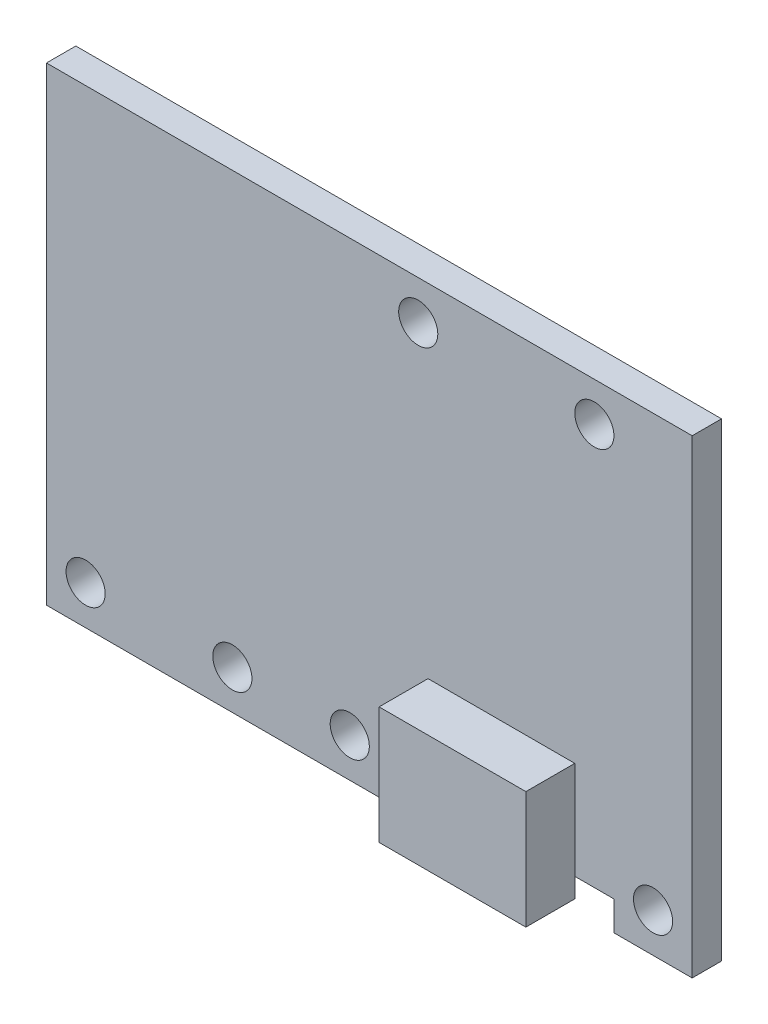
ISO-10303-21;
HEADER;
FILE_DESCRIPTION(('STEP AP214'),'2;1');
FILE_NAME('part.step','',(''),(''),'','','');
FILE_SCHEMA(('AUTOMOTIVE_DESIGN { 1 0 10303 214 1 1 1 1 }'));
ENDSEC;
DATA;
#1=APPLICATION_CONTEXT('core data for automotive mechanical design processes');
#2=APPLICATION_PROTOCOL_DEFINITION('international standard','automotive_design',2000,#1);
#3=PRODUCT_CONTEXT('',#1,'mechanical');
#4=PRODUCT('Part','Part','',(#3));
#5=PRODUCT_RELATED_PRODUCT_CATEGORY('part','',(#4));
#6=PRODUCT_DEFINITION_FORMATION('','',#4);
#7=PRODUCT_DEFINITION_CONTEXT('part definition',#1,'design');
#8=PRODUCT_DEFINITION('design','',#6,#7);
#9=PRODUCT_DEFINITION_SHAPE('','',#8);
#10=(LENGTH_UNIT() NAMED_UNIT(*) SI_UNIT(.MILLI.,.METRE.));
#11=(NAMED_UNIT(*) PLANE_ANGLE_UNIT() SI_UNIT($,.RADIAN.));
#12=(NAMED_UNIT(*) SI_UNIT($,.STERADIAN.) SOLID_ANGLE_UNIT());
#13=UNCERTAINTY_MEASURE_WITH_UNIT(LENGTH_MEASURE(1.E-05),#10,'distance_accuracy_value','');
#14=(GEOMETRIC_REPRESENTATION_CONTEXT(3) GLOBAL_UNCERTAINTY_ASSIGNED_CONTEXT((#13)) GLOBAL_UNIT_ASSIGNED_CONTEXT((#10,
#11,#12)) REPRESENTATION_CONTEXT('',''));
#15=CARTESIAN_POINT('',(0.,0.,0.));
#16=DIRECTION('',(0.,0.,1.));
#17=DIRECTION('',(1.,0.,0.));
#18=AXIS2_PLACEMENT_3D('',#15,#16,#17);
#19=CARTESIAN_POINT('',(0.,-12.,-1.5));
#20=DIRECTION('',(0.,-1.,0.));
#21=DIRECTION('',(0.,0.,-1.));
#22=AXIS2_PLACEMENT_3D('',#19,#20,#21);
#23=PLANE('',#22);
#24=DIRECTION('',(1.,0.,0.));
#25=VECTOR('',#24,1.);
#26=CARTESIAN_POINT('',(0.,-12.,0.));
#27=LINE('',#26,#25);
#28=CARTESIAN_POINT('',(-16.5,-12.,0.));
#29=VERTEX_POINT('',#28);
#30=CARTESIAN_POINT('',(1.,-12.,0.));
#31=VERTEX_POINT('',#30);
#32=EDGE_CURVE('E214',#29,#31,#27,.T.);
#33=ORIENTED_EDGE('',*,*,#32,.F.);
#34=DIRECTION('',(0.,0.,1.));
#35=VECTOR('',#34,1.);
#36=CARTESIAN_POINT('',(-16.5,-12.,-1.5));
#37=LINE('',#36,#35);
#38=CARTESIAN_POINT('',(-16.5,-12.,-1.5));
#39=VERTEX_POINT('',#38);
#40=EDGE_CURVE('E42',#39,#29,#37,.T.);
#41=ORIENTED_EDGE('',*,*,#40,.F.);
#42=DIRECTION('',(1.,0.,0.));
#43=VECTOR('',#42,1.);
#44=CARTESIAN_POINT('',(0.,-12.,-1.5));
#45=LINE('',#44,#43);
#46=CARTESIAN_POINT('',(1.,-12.,-1.5));
#47=VERTEX_POINT('',#46);
#48=EDGE_CURVE('E180',#39,#47,#45,.T.);
#49=ORIENTED_EDGE('',*,*,#48,.T.);
#50=DIRECTION('',(0.,0.,1.));
#51=VECTOR('',#50,1.);
#52=CARTESIAN_POINT('',(1.,-12.,-1.5));
#53=LINE('',#52,#51);
#54=EDGE_CURVE('E37',#47,#31,#53,.T.);
#55=ORIENTED_EDGE('',*,*,#54,.T.);
#56=EDGE_LOOP('',(#33,#41,#49,#55));
#57=FACE_BOUND('',#56,.T.);
#58=ADVANCED_FACE('F33',(#57),#23,.T.);
#59=CARTESIAN_POINT('',(-16.5,0.,-1.5));
#60=DIRECTION('',(-1.,0.,0.));
#61=DIRECTION('',(0.,-1.,0.));
#62=AXIS2_PLACEMENT_3D('',#59,#60,#61);
#63=PLANE('',#62);
#64=DIRECTION('',(0.,-1.,0.));
#65=VECTOR('',#64,1.);
#66=CARTESIAN_POINT('',(-16.5,0.,0.));
#67=LINE('',#66,#65);
#68=CARTESIAN_POINT('',(-16.5,12.,0.));
#69=VERTEX_POINT('',#68);
#70=EDGE_CURVE('E165',#69,#29,#67,.T.);
#71=ORIENTED_EDGE('',*,*,#70,.F.);
#72=DIRECTION('',(0.,0.,1.));
#73=VECTOR('',#72,1.);
#74=CARTESIAN_POINT('',(-16.5,12.,-1.5));
#75=LINE('',#74,#73);
#76=CARTESIAN_POINT('',(-16.5,12.,-1.5));
#77=VERTEX_POINT('',#76);
#78=EDGE_CURVE('E236',#77,#69,#75,.T.);
#79=ORIENTED_EDGE('',*,*,#78,.F.);
#80=DIRECTION('',(0.,-1.,0.));
#81=VECTOR('',#80,1.);
#82=CARTESIAN_POINT('',(-16.5,0.,-1.5));
#83=LINE('',#82,#81);
#84=EDGE_CURVE('E197',#77,#39,#83,.T.);
#85=ORIENTED_EDGE('',*,*,#84,.T.);
#86=ORIENTED_EDGE('',*,*,#40,.T.);
#87=EDGE_LOOP('',(#71,#79,#85,#86));
#88=FACE_BOUND('',#87,.T.);
#89=ADVANCED_FACE('F262',(#88),#63,.T.);
#90=CARTESIAN_POINT('',(0.,12.,-1.5));
#91=DIRECTION('',(0.,-1.,0.));
#92=DIRECTION('',(0.,0.,-1.));
#93=AXIS2_PLACEMENT_3D('',#90,#91,#92);
#94=PLANE('',#93);
#95=DIRECTION('',(1.,0.,0.));
#96=VECTOR('',#95,1.);
#97=CARTESIAN_POINT('',(0.,12.,0.));
#98=LINE('',#97,#96);
#99=CARTESIAN_POINT('',(16.5,12.,0.));
#100=VERTEX_POINT('',#99);
#101=EDGE_CURVE('E230',#69,#100,#98,.T.);
#102=ORIENTED_EDGE('',*,*,#101,.T.);
#103=DIRECTION('',(0.,0.,1.));
#104=VECTOR('',#103,1.);
#105=CARTESIAN_POINT('',(16.5,12.,-1.5));
#106=LINE('',#105,#104);
#107=CARTESIAN_POINT('',(16.5,12.,-1.5));
#108=VERTEX_POINT('',#107);
#109=EDGE_CURVE('E238',#108,#100,#106,.T.);
#110=ORIENTED_EDGE('',*,*,#109,.F.);
#111=DIRECTION('',(1.,0.,0.));
#112=VECTOR('',#111,1.);
#113=CARTESIAN_POINT('',(0.,12.,-1.5));
#114=LINE('',#113,#112);
#115=EDGE_CURVE('E194',#77,#108,#114,.T.);
#116=ORIENTED_EDGE('',*,*,#115,.F.);
#117=ORIENTED_EDGE('',*,*,#78,.T.);
#118=EDGE_LOOP('',(#102,#110,#116,#117));
#119=FACE_BOUND('',#118,.T.);
#120=ADVANCED_FACE('F309',(#119),#94,.F.);
#121=CARTESIAN_POINT('',(16.5,0.,-1.5));
#122=DIRECTION('',(-1.,0.,0.));
#123=DIRECTION('',(0.,0.,1.));
#124=AXIS2_PLACEMENT_3D('',#121,#122,#123);
#125=PLANE('',#124);
#126=DIRECTION('',(0.,-1.,0.));
#127=VECTOR('',#126,1.);
#128=CARTESIAN_POINT('',(16.5,0.,0.));
#129=LINE('',#128,#127);
#130=CARTESIAN_POINT('',(16.5,-12.,0.));
#131=VERTEX_POINT('',#130);
#132=EDGE_CURVE('E227',#100,#131,#129,.T.);
#133=ORIENTED_EDGE('',*,*,#132,.T.);
#134=DIRECTION('',(0.,0.,1.));
#135=VECTOR('',#134,1.);
#136=CARTESIAN_POINT('',(16.5,-12.,-1.5));
#137=LINE('',#136,#135);
#138=CARTESIAN_POINT('',(16.5,-12.,-1.5));
#139=VERTEX_POINT('',#138);
#140=EDGE_CURVE('E241',#139,#131,#137,.T.);
#141=ORIENTED_EDGE('',*,*,#140,.F.);
#142=DIRECTION('',(0.,-1.,0.));
#143=VECTOR('',#142,1.);
#144=CARTESIAN_POINT('',(16.5,0.,-1.5));
#145=LINE('',#144,#143);
#146=EDGE_CURVE('E192',#108,#139,#145,.T.);
#147=ORIENTED_EDGE('',*,*,#146,.F.);
#148=ORIENTED_EDGE('',*,*,#109,.T.);
#149=EDGE_LOOP('',(#133,#141,#147,#148));
#150=FACE_BOUND('',#149,.T.);
#151=ADVANCED_FACE('F315',(#150),#125,.F.);
#152=CARTESIAN_POINT('',(12.5,-12.,0.));
#153=VERTEX_POINT('',#152);
#154=EDGE_CURVE('E218',#153,#131,#27,.T.);
#155=ORIENTED_EDGE('',*,*,#154,.F.);
#156=DIRECTION('',(0.,0.,1.));
#157=VECTOR('',#156,1.);
#158=CARTESIAN_POINT('',(12.5,-12.,-1.5));
#159=LINE('',#158,#157);
#160=CARTESIAN_POINT('',(12.5,-12.,-1.5));
#161=VERTEX_POINT('',#160);
#162=EDGE_CURVE('E243',#161,#153,#159,.T.);
#163=ORIENTED_EDGE('',*,*,#162,.F.);
#164=EDGE_CURVE('E184',#161,#139,#45,.T.);
#165=ORIENTED_EDGE('',*,*,#164,.T.);
#166=ORIENTED_EDGE('',*,*,#140,.T.);
#167=EDGE_LOOP('',(#155,#163,#165,#166));
#168=FACE_BOUND('',#167,.T.);
#169=ADVANCED_FACE('F305',(#168),#23,.T.);
#170=CARTESIAN_POINT('',(12.5,0.,-1.5));
#171=DIRECTION('',(1.,0.,0.));
#172=DIRECTION('',(0.,0.,-1.));
#173=AXIS2_PLACEMENT_3D('',#170,#171,#172);
#174=PLANE('',#173);
#175=DIRECTION('',(0.,1.,0.));
#176=VECTOR('',#175,1.);
#177=CARTESIAN_POINT('',(12.5,0.,0.));
#178=LINE('',#177,#176);
#179=CARTESIAN_POINT('',(12.5,-10.5,0.));
#180=VERTEX_POINT('',#179);
#181=EDGE_CURVE('E223',#153,#180,#178,.T.);
#182=ORIENTED_EDGE('',*,*,#181,.T.);
#183=DIRECTION('',(0.,0.,1.));
#184=VECTOR('',#183,1.);
#185=CARTESIAN_POINT('',(12.5,-10.5,-1.5));
#186=LINE('',#185,#184);
#187=CARTESIAN_POINT('',(12.5,-10.5,-1.5));
#188=VERTEX_POINT('',#187);
#189=EDGE_CURVE('E245',#188,#180,#186,.T.);
#190=ORIENTED_EDGE('',*,*,#189,.F.);
#191=DIRECTION('',(0.,1.,0.));
#192=VECTOR('',#191,1.);
#193=CARTESIAN_POINT('',(12.5,0.,-1.5));
#194=LINE('',#193,#192);
#195=EDGE_CURVE('E189',#161,#188,#194,.T.);
#196=ORIENTED_EDGE('',*,*,#195,.F.);
#197=ORIENTED_EDGE('',*,*,#162,.T.);
#198=EDGE_LOOP('',(#182,#190,#196,#197));
#199=FACE_BOUND('',#198,.T.);
#200=ADVANCED_FACE('F314',(#199),#174,.F.);
#201=CARTESIAN_POINT('',(0.,-10.5,-1.5));
#202=DIRECTION('',(0.,1.,0.));
#203=DIRECTION('',(-1.,0.,0.));
#204=AXIS2_PLACEMENT_3D('',#201,#202,#203);
#205=PLANE('',#204);
#206=DIRECTION('',(-1.,0.,0.));
#207=VECTOR('',#206,1.);
#208=CARTESIAN_POINT('',(0.,-10.5,0.));
#209=LINE('',#208,#207);
#210=CARTESIAN_POINT('',(10.5,-10.5,0.));
#211=VERTEX_POINT('',#210);
#212=EDGE_CURVE('E220',#180,#211,#209,.T.);
#213=ORIENTED_EDGE('',*,*,#212,.T.);
#214=CARTESIAN_POINT('',(3.,-10.5,0.));
#215=VERTEX_POINT('',#214);
#216=EDGE_CURVE('E224',#211,#215,#209,.T.);
#217=ORIENTED_EDGE('',*,*,#216,.T.);
#218=CARTESIAN_POINT('',(1.,-10.5,0.));
#219=VERTEX_POINT('',#218);
#220=EDGE_CURVE('E56',#215,#219,#209,.T.);
#221=ORIENTED_EDGE('',*,*,#220,.T.);
#222=DIRECTION('',(0.,0.,1.));
#223=VECTOR('',#222,1.);
#224=CARTESIAN_POINT('',(1.,-10.5,-1.5));
#225=LINE('',#224,#223);
#226=CARTESIAN_POINT('',(1.,-10.5,-1.5));
#227=VERTEX_POINT('',#226);
#228=EDGE_CURVE('E247',#227,#219,#225,.T.);
#229=ORIENTED_EDGE('',*,*,#228,.F.);
#230=DIRECTION('',(-1.,0.,0.));
#231=VECTOR('',#230,1.);
#232=CARTESIAN_POINT('',(0.,-10.5,-1.5));
#233=LINE('',#232,#231);
#234=EDGE_CURVE('E187',#188,#227,#233,.T.);
#235=ORIENTED_EDGE('',*,*,#234,.F.);
#236=ORIENTED_EDGE('',*,*,#189,.T.);
#237=EDGE_LOOP('',(#213,#217,#221,#229,#235,#236));
#238=FACE_BOUND('',#237,.T.);
#239=ADVANCED_FACE('F271',(#238),#205,.F.);
#240=CARTESIAN_POINT('',(14.5,-10.,-1.5));
#241=DIRECTION('',(0.,0.,1.));
#242=DIRECTION('',(1.,0.,0.));
#243=AXIS2_PLACEMENT_3D('',#240,#241,#242);
#244=CYLINDRICAL_SURFACE('',#243,1.);
#245=CARTESIAN_POINT('',(14.5,-10.,-1.5));
#246=DIRECTION('',(0.,0.,1.));
#247=DIRECTION('',(1.,0.,0.));
#248=AXIS2_PLACEMENT_3D('',#245,#246,#247);
#249=CIRCLE('',#248,1.);
#250=CARTESIAN_POINT('',(15.5,-10.,-1.5));
#251=VERTEX_POINT('',#250);
#252=EDGE_CURVE('E177',#251,#251,#249,.T.);
#253=ORIENTED_EDGE('',*,*,#252,.F.);
#254=EDGE_LOOP('',(#253));
#255=FACE_BOUND('',#254,.T.);
#256=CARTESIAN_POINT('',(14.5,-10.,0.));
#257=DIRECTION('',(0.,0.,1.));
#258=DIRECTION('',(1.,0.,0.));
#259=AXIS2_PLACEMENT_3D('',#256,#257,#258);
#260=CIRCLE('',#259,1.);
#261=CARTESIAN_POINT('',(15.5,-10.,0.));
#262=VERTEX_POINT('',#261);
#263=EDGE_CURVE('E211',#262,#262,#260,.T.);
#264=ORIENTED_EDGE('',*,*,#263,.T.);
#265=EDGE_LOOP('',(#264));
#266=FACE_BOUND('',#265,.T.);
#267=ADVANCED_FACE('F436',(#255,#266),#244,.F.);
#268=CARTESIAN_POINT('',(-0.999999999999996,-10.,-1.5));
#269=DIRECTION('',(0.,0.,1.));
#270=DIRECTION('',(1.,0.,0.));
#271=AXIS2_PLACEMENT_3D('',#268,#269,#270);
#272=CYLINDRICAL_SURFACE('',#271,1.);
#273=CARTESIAN_POINT('',(-0.999999999999996,-10.,-1.5));
#274=DIRECTION('',(0.,0.,1.));
#275=DIRECTION('',(1.,0.,0.));
#276=AXIS2_PLACEMENT_3D('',#273,#274,#275);
#277=CIRCLE('',#276,1.);
#278=CARTESIAN_POINT('',(0.,-10.,-1.5));
#279=VERTEX_POINT('',#278);
#280=EDGE_CURVE('E174',#279,#279,#277,.T.);
#281=ORIENTED_EDGE('',*,*,#280,.F.);
#282=EDGE_LOOP('',(#281));
#283=FACE_BOUND('',#282,.T.);
#284=CARTESIAN_POINT('',(-0.999999999999996,-10.,0.));
#285=DIRECTION('',(0.,0.,1.));
#286=DIRECTION('',(1.,0.,0.));
#287=AXIS2_PLACEMENT_3D('',#284,#285,#286);
#288=CIRCLE('',#287,1.);
#289=CARTESIAN_POINT('',(0.,-10.,0.));
#290=VERTEX_POINT('',#289);
#291=EDGE_CURVE('E208',#290,#290,#288,.T.);
#292=ORIENTED_EDGE('',*,*,#291,.T.);
#293=EDGE_LOOP('',(#292));
#294=FACE_BOUND('',#293,.T.);
#295=ADVANCED_FACE('F427',(#283,#294),#272,.F.);
#296=CARTESIAN_POINT('',(-7.,-10.,-1.5));
#297=DIRECTION('',(0.,0.,1.));
#298=DIRECTION('',(1.,0.,0.));
#299=AXIS2_PLACEMENT_3D('',#296,#297,#298);
#300=CYLINDRICAL_SURFACE('',#299,1.);
#301=CARTESIAN_POINT('',(-7.,-10.,-1.5));
#302=DIRECTION('',(0.,0.,1.));
#303=DIRECTION('',(1.,0.,0.));
#304=AXIS2_PLACEMENT_3D('',#301,#302,#303);
#305=CIRCLE('',#304,1.);
#306=CARTESIAN_POINT('',(-6.,-10.,-1.5));
#307=VERTEX_POINT('',#306);
#308=EDGE_CURVE('E171',#307,#307,#305,.T.);
#309=ORIENTED_EDGE('',*,*,#308,.F.);
#310=EDGE_LOOP('',(#309));
#311=FACE_BOUND('',#310,.T.);
#312=CARTESIAN_POINT('',(-7.,-10.,0.));
#313=DIRECTION('',(0.,0.,1.));
#314=DIRECTION('',(1.,0.,0.));
#315=AXIS2_PLACEMENT_3D('',#312,#313,#314);
#316=CIRCLE('',#315,1.);
#317=CARTESIAN_POINT('',(-6.,-10.,0.));
#318=VERTEX_POINT('',#317);
#319=EDGE_CURVE('E205',#318,#318,#316,.T.);
#320=ORIENTED_EDGE('',*,*,#319,.T.);
#321=EDGE_LOOP('',(#320));
#322=FACE_BOUND('',#321,.T.);
#323=ADVANCED_FACE('F418',(#311,#322),#300,.F.);
#324=CARTESIAN_POINT('',(-14.5,-10.,-1.5));
#325=DIRECTION('',(0.,0.,1.));
#326=DIRECTION('',(1.,0.,0.));
#327=AXIS2_PLACEMENT_3D('',#324,#325,#326);
#328=CYLINDRICAL_SURFACE('',#327,1.);
#329=CARTESIAN_POINT('',(-14.5,-10.,-1.5));
#330=DIRECTION('',(0.,0.,1.));
#331=DIRECTION('',(1.,0.,0.));
#332=AXIS2_PLACEMENT_3D('',#329,#330,#331);
#333=CIRCLE('',#332,1.);
#334=CARTESIAN_POINT('',(-13.5,-10.,-1.5));
#335=VERTEX_POINT('',#334);
#336=EDGE_CURVE('E168',#335,#335,#333,.T.);
#337=ORIENTED_EDGE('',*,*,#336,.F.);
#338=EDGE_LOOP('',(#337));
#339=FACE_BOUND('',#338,.T.);
#340=CARTESIAN_POINT('',(-14.5,-10.,0.));
#341=DIRECTION('',(0.,0.,1.));
#342=DIRECTION('',(1.,0.,0.));
#343=AXIS2_PLACEMENT_3D('',#340,#341,#342);
#344=CIRCLE('',#343,1.);
#345=CARTESIAN_POINT('',(-13.5,-10.,0.));
#346=VERTEX_POINT('',#345);
#347=EDGE_CURVE('E202',#346,#346,#344,.T.);
#348=ORIENTED_EDGE('',*,*,#347,.T.);
#349=EDGE_LOOP('',(#348));
#350=FACE_BOUND('',#349,.T.);
#351=ADVANCED_FACE('F410',(#339,#350),#328,.F.);
#352=CARTESIAN_POINT('',(2.5,10.,-1.5));
#353=DIRECTION('',(0.,0.,1.));
#354=DIRECTION('',(1.,0.,0.));
#355=AXIS2_PLACEMENT_3D('',#352,#353,#354);
#356=CYLINDRICAL_SURFACE('',#355,1.);
#357=CARTESIAN_POINT('',(2.5,10.,-1.5));
#358=DIRECTION('',(0.,0.,1.));
#359=DIRECTION('',(1.,0.,0.));
#360=AXIS2_PLACEMENT_3D('',#357,#358,#359);
#361=CIRCLE('',#360,1.);
#362=CARTESIAN_POINT('',(3.5,10.,-1.5));
#363=VERTEX_POINT('',#362);
#364=EDGE_CURVE('E164',#363,#363,#361,.T.);
#365=ORIENTED_EDGE('',*,*,#364,.F.);
#366=EDGE_LOOP('',(#365));
#367=FACE_BOUND('',#366,.T.);
#368=CARTESIAN_POINT('',(2.5,10.,0.));
#369=DIRECTION('',(0.,0.,1.));
#370=DIRECTION('',(1.,0.,0.));
#371=AXIS2_PLACEMENT_3D('',#368,#369,#370);
#372=CIRCLE('',#371,1.);
#373=CARTESIAN_POINT('',(3.5,10.,0.));
#374=VERTEX_POINT('',#373);
#375=EDGE_CURVE('E155',#374,#374,#372,.T.);
#376=ORIENTED_EDGE('',*,*,#375,.T.);
#377=EDGE_LOOP('',(#376));
#378=FACE_BOUND('',#377,.T.);
#379=ADVANCED_FACE('F402',(#367,#378),#356,.F.);
#380=CARTESIAN_POINT('',(11.5,10.,-1.5));
#381=DIRECTION('',(0.,0.,1.));
#382=DIRECTION('',(1.,0.,0.));
#383=AXIS2_PLACEMENT_3D('',#380,#381,#382);
#384=CYLINDRICAL_SURFACE('',#383,1.);
#385=CARTESIAN_POINT('',(11.5,10.,-1.5));
#386=DIRECTION('',(0.,0.,1.));
#387=DIRECTION('',(1.,0.,0.));
#388=AXIS2_PLACEMENT_3D('',#385,#386,#387);
#389=CIRCLE('',#388,1.);
#390=CARTESIAN_POINT('',(12.5,10.,-1.5));
#391=VERTEX_POINT('',#390);
#392=EDGE_CURVE('E161',#391,#391,#389,.T.);
#393=ORIENTED_EDGE('',*,*,#392,.F.);
#394=EDGE_LOOP('',(#393));
#395=FACE_BOUND('',#394,.T.);
#396=CARTESIAN_POINT('',(11.5,10.,0.));
#397=DIRECTION('',(0.,0.,1.));
#398=DIRECTION('',(1.,0.,0.));
#399=AXIS2_PLACEMENT_3D('',#396,#397,#398);
#400=CIRCLE('',#399,1.);
#401=CARTESIAN_POINT('',(12.5,10.,0.));
#402=VERTEX_POINT('',#401);
#403=EDGE_CURVE('E152',#402,#402,#400,.T.);
#404=ORIENTED_EDGE('',*,*,#403,.T.);
#405=EDGE_LOOP('',(#404));
#406=FACE_BOUND('',#405,.T.);
#407=ADVANCED_FACE('F35',(#395,#406),#384,.F.);
#408=CARTESIAN_POINT('',(1.,0.,-1.5));
#409=DIRECTION('',(1.,0.,0.));
#410=DIRECTION('',(0.,0.,-1.));
#411=AXIS2_PLACEMENT_3D('',#408,#409,#410);
#412=PLANE('',#411);
#413=DIRECTION('',(0.,1.,0.));
#414=VECTOR('',#413,1.);
#415=CARTESIAN_POINT('',(1.,0.,0.));
#416=LINE('',#415,#414);
#417=EDGE_CURVE('E217',#31,#219,#416,.T.);
#418=ORIENTED_EDGE('',*,*,#417,.F.);
#419=ORIENTED_EDGE('',*,*,#54,.F.);
#420=DIRECTION('',(0.,1.,0.));
#421=VECTOR('',#420,1.);
#422=CARTESIAN_POINT('',(1.,0.,-1.5));
#423=LINE('',#422,#421);
#424=EDGE_CURVE('E183',#47,#227,#423,.T.);
#425=ORIENTED_EDGE('',*,*,#424,.T.);
#426=ORIENTED_EDGE('',*,*,#228,.T.);
#427=EDGE_LOOP('',(#418,#419,#425,#426));
#428=FACE_BOUND('',#427,.T.);
#429=ADVANCED_FACE('F256',(#428),#412,.T.);
#430=CARTESIAN_POINT('',(0.,0.,-1.5));
#431=DIRECTION('',(0.,0.,1.));
#432=DIRECTION('',(1.,0.,0.));
#433=AXIS2_PLACEMENT_3D('',#430,#431,#432);
#434=PLANE('',#433);
#435=ORIENTED_EDGE('',*,*,#392,.T.);
#436=EDGE_LOOP('',(#435));
#437=FACE_BOUND('',#436,.T.);
#438=ORIENTED_EDGE('',*,*,#364,.T.);
#439=EDGE_LOOP('',(#438));
#440=FACE_BOUND('',#439,.T.);
#441=ORIENTED_EDGE('',*,*,#336,.T.);
#442=EDGE_LOOP('',(#441));
#443=FACE_BOUND('',#442,.T.);
#444=ORIENTED_EDGE('',*,*,#308,.T.);
#445=EDGE_LOOP('',(#444));
#446=FACE_BOUND('',#445,.T.);
#447=ORIENTED_EDGE('',*,*,#280,.T.);
#448=EDGE_LOOP('',(#447));
#449=FACE_BOUND('',#448,.T.);
#450=ORIENTED_EDGE('',*,*,#252,.T.);
#451=EDGE_LOOP('',(#450));
#452=FACE_BOUND('',#451,.T.);
#453=ORIENTED_EDGE('',*,*,#48,.F.);
#454=ORIENTED_EDGE('',*,*,#84,.F.);
#455=ORIENTED_EDGE('',*,*,#115,.T.);
#456=ORIENTED_EDGE('',*,*,#146,.T.);
#457=ORIENTED_EDGE('',*,*,#164,.F.);
#458=ORIENTED_EDGE('',*,*,#195,.T.);
#459=ORIENTED_EDGE('',*,*,#234,.T.);
#460=ORIENTED_EDGE('',*,*,#424,.F.);
#461=EDGE_LOOP('',(#453,#454,#455,#456,#457,#458,#459,#460));
#462=FACE_BOUND('',#461,.T.);
#463=ADVANCED_FACE('F266',(#437,#440,#443,#446,#449,#452,#462),#434,.F.);
#464=CARTESIAN_POINT('',(0.,0.,0.));
#465=DIRECTION('',(0.,0.,1.));
#466=DIRECTION('',(1.,0.,0.));
#467=AXIS2_PLACEMENT_3D('',#464,#465,#466);
#468=PLANE('',#467);
#469=DIRECTION('',(0.,1.,0.));
#470=VECTOR('',#469,1.);
#471=CARTESIAN_POINT('',(10.5,-5.50000000000001,0.));
#472=LINE('',#471,#470);
#473=CARTESIAN_POINT('',(10.5,-5.50000000000001,0.));
#474=VERTEX_POINT('',#473);
#475=EDGE_CURVE('E11',#211,#474,#472,.T.);
#476=ORIENTED_EDGE('',*,*,#475,.F.);
#477=ORIENTED_EDGE('',*,*,#212,.F.);
#478=ORIENTED_EDGE('',*,*,#181,.F.);
#479=ORIENTED_EDGE('',*,*,#154,.T.);
#480=ORIENTED_EDGE('',*,*,#132,.F.);
#481=ORIENTED_EDGE('',*,*,#101,.F.);
#482=ORIENTED_EDGE('',*,*,#70,.T.);
#483=ORIENTED_EDGE('',*,*,#32,.T.);
#484=ORIENTED_EDGE('',*,*,#417,.T.);
#485=ORIENTED_EDGE('',*,*,#220,.F.);
#486=DIRECTION('',(0.,-1.,0.));
#487=VECTOR('',#486,1.);
#488=CARTESIAN_POINT('',(3.,-5.50000000000001,0.));
#489=LINE('',#488,#487);
#490=CARTESIAN_POINT('',(3.,-5.50000000000001,0.));
#491=VERTEX_POINT('',#490);
#492=EDGE_CURVE('E283',#491,#215,#489,.T.);
#493=ORIENTED_EDGE('',*,*,#492,.F.);
#494=DIRECTION('',(-1.,0.,0.));
#495=VECTOR('',#494,1.);
#496=CARTESIAN_POINT('',(3.,-5.50000000000001,0.));
#497=LINE('',#496,#495);
#498=EDGE_CURVE('E51',#474,#491,#497,.T.);
#499=ORIENTED_EDGE('',*,*,#498,.F.);
#500=EDGE_LOOP('',(#476,#477,#478,#479,#480,#481,#482,#483,#484,#485,#493,#499));
#501=FACE_BOUND('',#500,.T.);
#502=ORIENTED_EDGE('',*,*,#403,.F.);
#503=EDGE_LOOP('',(#502));
#504=FACE_BOUND('',#503,.T.);
#505=ORIENTED_EDGE('',*,*,#375,.F.);
#506=EDGE_LOOP('',(#505));
#507=FACE_BOUND('',#506,.T.);
#508=ORIENTED_EDGE('',*,*,#347,.F.);
#509=EDGE_LOOP('',(#508));
#510=FACE_BOUND('',#509,.T.);
#511=ORIENTED_EDGE('',*,*,#319,.F.);
#512=EDGE_LOOP('',(#511));
#513=FACE_BOUND('',#512,.T.);
#514=ORIENTED_EDGE('',*,*,#291,.F.);
#515=EDGE_LOOP('',(#514));
#516=FACE_BOUND('',#515,.T.);
#517=ORIENTED_EDGE('',*,*,#263,.F.);
#518=EDGE_LOOP('',(#517));
#519=FACE_BOUND('',#518,.T.);
#520=ADVANCED_FACE('F257',(#501,#504,#507,#510,#513,#516,#519),#468,.T.);
#521=CARTESIAN_POINT('',(10.5,-5.50000000000001,2.5));
#522=DIRECTION('',(-1.,0.,0.));
#523=DIRECTION('',(0.,-1.,0.));
#524=AXIS2_PLACEMENT_3D('',#521,#522,#523);
#525=PLANE('',#524);
#526=CARTESIAN_POINT('',(10.5,-11.5,0.));
#527=VERTEX_POINT('',#526);
#528=EDGE_CURVE('E44',#527,#211,#472,.T.);
#529=ORIENTED_EDGE('',*,*,#528,.T.);
#530=ORIENTED_EDGE('',*,*,#475,.T.);
#531=DIRECTION('',(0.,0.,-1.));
#532=VECTOR('',#531,1.);
#533=CARTESIAN_POINT('',(10.5,-5.50000000000001,2.5));
#534=LINE('',#533,#532);
#535=CARTESIAN_POINT('',(10.5,-5.50000000000001,2.5));
#536=VERTEX_POINT('',#535);
#537=EDGE_CURVE('E133',#536,#474,#534,.T.);
#538=ORIENTED_EDGE('',*,*,#537,.F.);
#539=DIRECTION('',(0.,1.,0.));
#540=VECTOR('',#539,1.);
#541=CARTESIAN_POINT('',(10.5,-5.50000000000001,2.5));
#542=LINE('',#541,#540);
#543=CARTESIAN_POINT('',(10.5,-11.5,2.5));
#544=VERTEX_POINT('',#543);
#545=EDGE_CURVE('E139',#544,#536,#542,.T.);
#546=ORIENTED_EDGE('',*,*,#545,.F.);
#547=DIRECTION('',(0.,0.,-1.));
#548=VECTOR('',#547,1.);
#549=CARTESIAN_POINT('',(10.5,-11.5,2.5));
#550=LINE('',#549,#548);
#551=EDGE_CURVE('E289',#544,#527,#550,.T.);
#552=ORIENTED_EDGE('',*,*,#551,.T.);
#553=EDGE_LOOP('',(#529,#530,#538,#546,#552));
#554=FACE_BOUND('',#553,.T.);
#555=ADVANCED_FACE('F151',(#554),#525,.F.);
#556=CARTESIAN_POINT('',(3.,-5.50000000000001,2.5));
#557=DIRECTION('',(0.,-1.,0.));
#558=DIRECTION('',(0.,0.,-1.));
#559=AXIS2_PLACEMENT_3D('',#556,#557,#558);
#560=PLANE('',#559);
#561=ORIENTED_EDGE('',*,*,#498,.T.);
#562=DIRECTION('',(0.,0.,-1.));
#563=VECTOR('',#562,1.);
#564=CARTESIAN_POINT('',(3.,-5.50000000000001,2.5));
#565=LINE('',#564,#563);
#566=CARTESIAN_POINT('',(3.,-5.50000000000001,2.5));
#567=VERTEX_POINT('',#566);
#568=EDGE_CURVE('E135',#567,#491,#565,.T.);
#569=ORIENTED_EDGE('',*,*,#568,.F.);
#570=DIRECTION('',(-1.,0.,0.));
#571=VECTOR('',#570,1.);
#572=CARTESIAN_POINT('',(3.,-5.50000000000001,2.5));
#573=LINE('',#572,#571);
#574=EDGE_CURVE('E129',#536,#567,#573,.T.);
#575=ORIENTED_EDGE('',*,*,#574,.F.);
#576=ORIENTED_EDGE('',*,*,#537,.T.);
#577=EDGE_LOOP('',(#561,#569,#575,#576));
#578=FACE_BOUND('',#577,.T.);
#579=ADVANCED_FACE('F131',(#578),#560,.F.);
#580=CARTESIAN_POINT('',(3.,-5.50000000000001,2.5));
#581=DIRECTION('',(1.,0.,0.));
#582=DIRECTION('',(0.,1.,0.));
#583=AXIS2_PLACEMENT_3D('',#580,#581,#582);
#584=PLANE('',#583);
#585=ORIENTED_EDGE('',*,*,#492,.T.);
#586=CARTESIAN_POINT('',(3.,-11.5,0.));
#587=VERTEX_POINT('',#586);
#588=EDGE_CURVE('E277',#215,#587,#489,.T.);
#589=ORIENTED_EDGE('',*,*,#588,.T.);
#590=DIRECTION('',(0.,0.,-1.));
#591=VECTOR('',#590,1.);
#592=CARTESIAN_POINT('',(3.,-11.5,2.5));
#593=LINE('',#592,#591);
#594=CARTESIAN_POINT('',(3.,-11.5,2.5));
#595=VERTEX_POINT('',#594);
#596=EDGE_CURVE('E157',#595,#587,#593,.T.);
#597=ORIENTED_EDGE('',*,*,#596,.F.);
#598=DIRECTION('',(0.,-1.,0.));
#599=VECTOR('',#598,1.);
#600=CARTESIAN_POINT('',(3.,-5.50000000000001,2.5));
#601=LINE('',#600,#599);
#602=EDGE_CURVE('E138',#567,#595,#601,.T.);
#603=ORIENTED_EDGE('',*,*,#602,.F.);
#604=ORIENTED_EDGE('',*,*,#568,.T.);
#605=EDGE_LOOP('',(#585,#589,#597,#603,#604));
#606=FACE_BOUND('',#605,.T.);
#607=ADVANCED_FACE('F285',(#606),#584,.F.);
#608=CARTESIAN_POINT('',(3.,-11.5,2.5));
#609=DIRECTION('',(0.,1.,0.));
#610=DIRECTION('',(0.,0.,1.));
#611=AXIS2_PLACEMENT_3D('',#608,#609,#610);
#612=PLANE('',#611);
#613=DIRECTION('',(1.,0.,0.));
#614=VECTOR('',#613,1.);
#615=CARTESIAN_POINT('',(3.,-11.5,0.));
#616=LINE('',#615,#614);
#617=EDGE_CURVE('E148',#587,#527,#616,.T.);
#618=ORIENTED_EDGE('',*,*,#617,.T.);
#619=ORIENTED_EDGE('',*,*,#551,.F.);
#620=DIRECTION('',(1.,0.,0.));
#621=VECTOR('',#620,1.);
#622=CARTESIAN_POINT('',(3.,-11.5,2.5));
#623=LINE('',#622,#621);
#624=EDGE_CURVE('E144',#595,#544,#623,.T.);
#625=ORIENTED_EDGE('',*,*,#624,.F.);
#626=ORIENTED_EDGE('',*,*,#596,.T.);
#627=EDGE_LOOP('',(#618,#619,#625,#626));
#628=FACE_BOUND('',#627,.T.);
#629=ADVANCED_FACE('F291',(#628),#612,.F.);
#630=CARTESIAN_POINT('',(0.,0.,2.5));
#631=DIRECTION('',(0.,0.,1.));
#632=DIRECTION('',(1.,0.,0.));
#633=AXIS2_PLACEMENT_3D('',#630,#631,#632);
#634=PLANE('',#633);
#635=ORIENTED_EDGE('',*,*,#545,.T.);
#636=ORIENTED_EDGE('',*,*,#574,.T.);
#637=ORIENTED_EDGE('',*,*,#602,.T.);
#638=ORIENTED_EDGE('',*,*,#624,.T.);
#639=EDGE_LOOP('',(#635,#636,#637,#638));
#640=FACE_BOUND('',#639,.T.);
#641=ADVANCED_FACE('F142',(#640),#634,.T.);
#642=CARTESIAN_POINT('',(0.,0.,0.));
#643=DIRECTION('',(0.,0.,1.));
#644=DIRECTION('',(1.,0.,0.));
#645=AXIS2_PLACEMENT_3D('',#642,#643,#644);
#646=PLANE('',#645);
#647=ORIENTED_EDGE('',*,*,#216,.F.);
#648=ORIENTED_EDGE('',*,*,#528,.F.);
#649=ORIENTED_EDGE('',*,*,#617,.F.);
#650=ORIENTED_EDGE('',*,*,#588,.F.);
#651=EDGE_LOOP('',(#647,#648,#649,#650));
#652=FACE_BOUND('',#651,.T.);
#653=ADVANCED_FACE('F279',(#652),#646,.F.);
#654=CLOSED_SHELL('',(#58,#89,#120,#151,#169,#200,#239,#267,#295,#323,#351,#379,#407,#429,#463,
#520,#555,#579,#607,#629,#641,#653));
#655=MANIFOLD_SOLID_BREP('B2',#654);
#656=ADVANCED_BREP_SHAPE_REPRESENTATION('',(#18,#655),#14);
#657=SHAPE_DEFINITION_REPRESENTATION(#9,#656);
ENDSEC;
END-ISO-10303-21;
